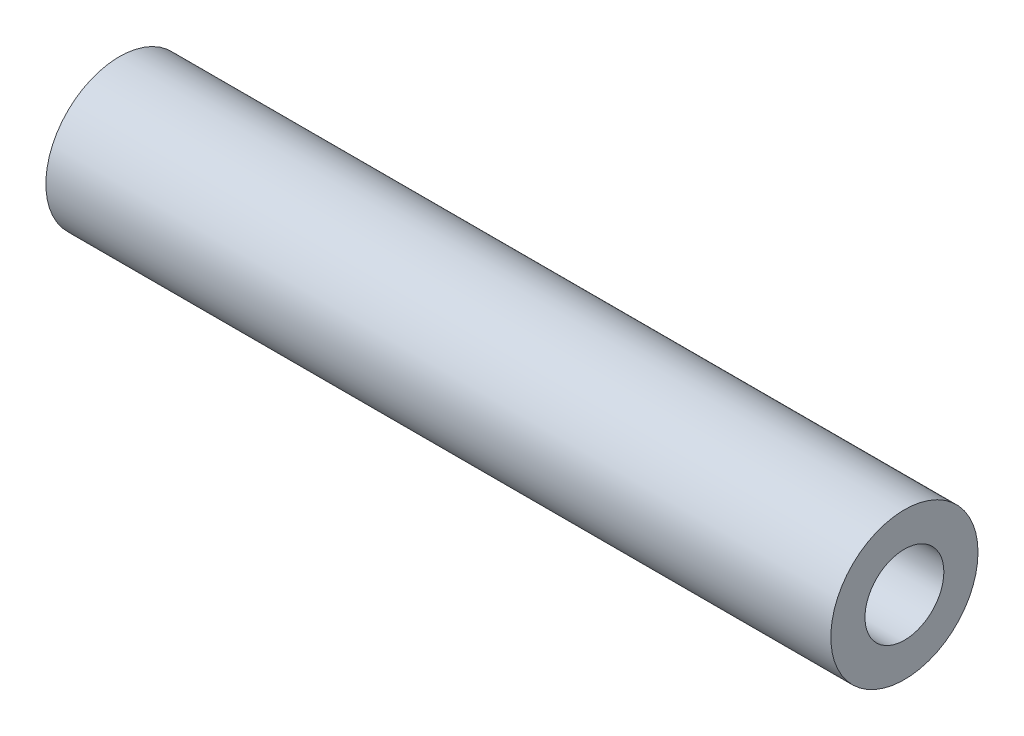
ISO-10303-21;
HEADER;
FILE_DESCRIPTION(('STEP AP214'),'2;1');
FILE_NAME('part.step','',(''),(''),'','','');
FILE_SCHEMA(('AUTOMOTIVE_DESIGN { 1 0 10303 214 1 1 1 1 }'));
ENDSEC;
DATA;
#1=APPLICATION_CONTEXT('core data for automotive mechanical design processes');
#2=APPLICATION_PROTOCOL_DEFINITION('international standard','automotive_design',2000,#1);
#3=PRODUCT_CONTEXT('',#1,'mechanical');
#4=PRODUCT('Part','Part','',(#3));
#5=PRODUCT_RELATED_PRODUCT_CATEGORY('part','',(#4));
#6=PRODUCT_DEFINITION_FORMATION('','',#4);
#7=PRODUCT_DEFINITION_CONTEXT('part definition',#1,'design');
#8=PRODUCT_DEFINITION('design','',#6,#7);
#9=PRODUCT_DEFINITION_SHAPE('','',#8);
#10=(LENGTH_UNIT() NAMED_UNIT(*) SI_UNIT(.MILLI.,.METRE.));
#11=(NAMED_UNIT(*) PLANE_ANGLE_UNIT() SI_UNIT($,.RADIAN.));
#12=(NAMED_UNIT(*) SI_UNIT($,.STERADIAN.) SOLID_ANGLE_UNIT());
#13=UNCERTAINTY_MEASURE_WITH_UNIT(LENGTH_MEASURE(1.E-05),#10,'distance_accuracy_value','');
#14=(GEOMETRIC_REPRESENTATION_CONTEXT(3) GLOBAL_UNCERTAINTY_ASSIGNED_CONTEXT((#13)) GLOBAL_UNIT_ASSIGNED_CONTEXT((#10,
#11,#12)) REPRESENTATION_CONTEXT('',''));
#15=CARTESIAN_POINT('',(0.,0.,0.));
#16=DIRECTION('',(0.,0.,1.));
#17=DIRECTION('',(1.,0.,0.));
#18=AXIS2_PLACEMENT_3D('',#15,#16,#17);
#19=CARTESIAN_POINT('',(50.8,0.,0.));
#20=DIRECTION('',(1.,0.,0.));
#21=DIRECTION('',(0.,0.,-1.));
#22=AXIS2_PLACEMENT_3D('',#19,#20,#21);
#23=PLANE('',#22);
#24=CARTESIAN_POINT('',(50.8,0.,0.));
#25=DIRECTION('',(1.,0.,0.));
#26=DIRECTION('',(0.,0.,-1.));
#27=AXIS2_PLACEMENT_3D('',#24,#25,#26);
#28=CIRCLE('',#27,4.7625);
#29=CARTESIAN_POINT('',(50.8,0.,-4.7625));
#30=VERTEX_POINT('',#29);
#31=EDGE_CURVE('E10',#30,#30,#28,.T.);
#32=ORIENTED_EDGE('',*,*,#31,.T.);
#33=EDGE_LOOP('',(#32));
#34=FACE_BOUND('',#33,.T.);
#35=CARTESIAN_POINT('',(50.8,0.,0.));
#36=DIRECTION('',(1.,0.,0.));
#37=DIRECTION('',(0.,0.,-1.));
#38=AXIS2_PLACEMENT_3D('',#35,#36,#37);
#39=CIRCLE('',#38,2.5527);
#40=CARTESIAN_POINT('',(50.8,0.,-2.5527));
#41=VERTEX_POINT('',#40);
#42=EDGE_CURVE('E48',#41,#41,#39,.T.);
#43=ORIENTED_EDGE('',*,*,#42,.F.);
#44=EDGE_LOOP('',(#43));
#45=FACE_BOUND('',#44,.T.);
#46=ADVANCED_FACE('F37',(#34,#45),#23,.T.);
#47=CARTESIAN_POINT('',(0.,0.,0.));
#48=DIRECTION('',(1.,0.,0.));
#49=DIRECTION('',(0.,0.,-1.));
#50=AXIS2_PLACEMENT_3D('',#47,#48,#49);
#51=PLANE('',#50);
#52=CARTESIAN_POINT('',(0.,0.,0.));
#53=DIRECTION('',(1.,0.,0.));
#54=DIRECTION('',(0.,0.,-1.));
#55=AXIS2_PLACEMENT_3D('',#52,#53,#54);
#56=CIRCLE('',#55,4.7625);
#57=CARTESIAN_POINT('',(0.,0.,-4.7625));
#58=VERTEX_POINT('',#57);
#59=EDGE_CURVE('E41',#58,#58,#56,.T.);
#60=ORIENTED_EDGE('',*,*,#59,.F.);
#61=EDGE_LOOP('',(#60));
#62=FACE_BOUND('',#61,.T.);
#63=CARTESIAN_POINT('',(0.,0.,0.));
#64=DIRECTION('',(1.,0.,0.));
#65=DIRECTION('',(0.,0.,-1.));
#66=AXIS2_PLACEMENT_3D('',#63,#64,#65);
#67=CIRCLE('',#66,2.5527);
#68=CARTESIAN_POINT('',(0.,0.,-2.5527));
#69=VERTEX_POINT('',#68);
#70=EDGE_CURVE('E50',#69,#69,#67,.T.);
#71=ORIENTED_EDGE('',*,*,#70,.T.);
#72=EDGE_LOOP('',(#71));
#73=FACE_BOUND('',#72,.T.);
#74=ADVANCED_FACE('F60',(#62,#73),#51,.F.);
#75=CARTESIAN_POINT('',(50.8,0.,0.));
#76=DIRECTION('',(-1.,0.,0.));
#77=DIRECTION('',(0.,0.,1.));
#78=AXIS2_PLACEMENT_3D('',#75,#76,#77);
#79=CYLINDRICAL_SURFACE('',#78,4.7625);
#80=ORIENTED_EDGE('',*,*,#31,.F.);
#81=EDGE_LOOP('',(#80));
#82=FACE_BOUND('',#81,.T.);
#83=ORIENTED_EDGE('',*,*,#59,.T.);
#84=EDGE_LOOP('',(#83));
#85=FACE_BOUND('',#84,.T.);
#86=ADVANCED_FACE('F39',(#82,#85),#79,.T.);
#87=CARTESIAN_POINT('',(50.8,0.,0.));
#88=DIRECTION('',(-1.,0.,0.));
#89=DIRECTION('',(0.,0.,1.));
#90=AXIS2_PLACEMENT_3D('',#87,#88,#89);
#91=CYLINDRICAL_SURFACE('',#90,2.5527);
#92=ORIENTED_EDGE('',*,*,#42,.T.);
#93=EDGE_LOOP('',(#92));
#94=FACE_BOUND('',#93,.T.);
#95=ORIENTED_EDGE('',*,*,#70,.F.);
#96=EDGE_LOOP('',(#95));
#97=FACE_BOUND('',#96,.T.);
#98=ADVANCED_FACE('F56',(#94,#97),#91,.F.);
#99=CLOSED_SHELL('',(#46,#74,#86,#98));
#100=MANIFOLD_SOLID_BREP('B2',#99);
#101=ADVANCED_BREP_SHAPE_REPRESENTATION('',(#18,#100),#14);
#102=SHAPE_DEFINITION_REPRESENTATION(#9,#101);
ENDSEC;
END-ISO-10303-21;
